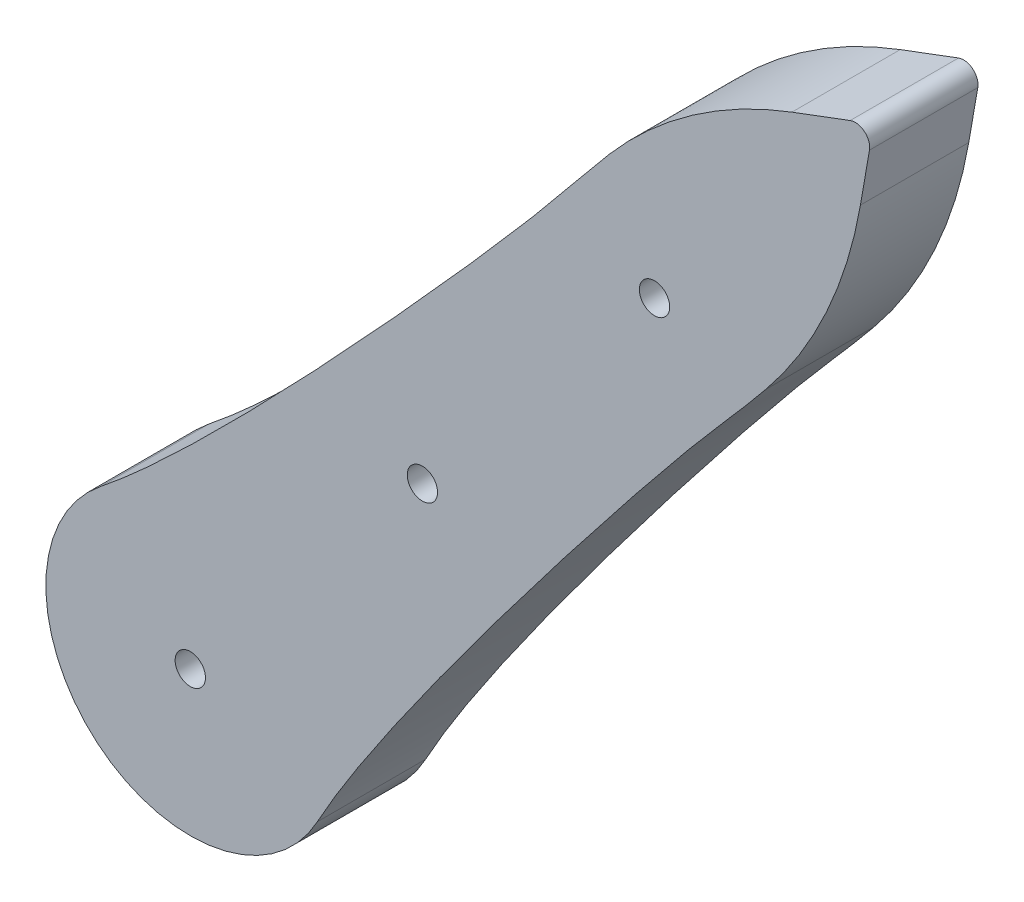
ISO-10303-21;
HEADER;
FILE_DESCRIPTION(('STEP AP214'),'2;1');
FILE_NAME('part.step','',(''),(''),'','','');
FILE_SCHEMA(('AUTOMOTIVE_DESIGN { 1 0 10303 214 1 1 1 1 }'));
ENDSEC;
DATA;
#1=APPLICATION_CONTEXT('core data for automotive mechanical design processes');
#2=APPLICATION_PROTOCOL_DEFINITION('international standard','automotive_design',2000,#1);
#3=PRODUCT_CONTEXT('',#1,'mechanical');
#4=PRODUCT('Part','Part','',(#3));
#5=PRODUCT_RELATED_PRODUCT_CATEGORY('part','',(#4));
#6=PRODUCT_DEFINITION_FORMATION('','',#4);
#7=PRODUCT_DEFINITION_CONTEXT('part definition',#1,'design');
#8=PRODUCT_DEFINITION('design','',#6,#7);
#9=PRODUCT_DEFINITION_SHAPE('','',#8);
#10=(LENGTH_UNIT() NAMED_UNIT(*) SI_UNIT(.MILLI.,.METRE.));
#11=(NAMED_UNIT(*) PLANE_ANGLE_UNIT() SI_UNIT($,.RADIAN.));
#12=(NAMED_UNIT(*) SI_UNIT($,.STERADIAN.) SOLID_ANGLE_UNIT());
#13=UNCERTAINTY_MEASURE_WITH_UNIT(LENGTH_MEASURE(1.E-05),#10,'distance_accuracy_value','');
#14=(GEOMETRIC_REPRESENTATION_CONTEXT(3) GLOBAL_UNCERTAINTY_ASSIGNED_CONTEXT((#13)) GLOBAL_UNIT_ASSIGNED_CONTEXT((#10,
#11,#12)) REPRESENTATION_CONTEXT('',''));
#15=CARTESIAN_POINT('',(0.,0.,0.));
#16=DIRECTION('',(0.,0.,1.));
#17=DIRECTION('',(1.,0.,0.));
#18=AXIS2_PLACEMENT_3D('',#15,#16,#17);
#19=CARTESIAN_POINT('',(76.5989589468399,-175.143739229266,31.));
#20=DIRECTION('',(0.,0.,1.));
#21=DIRECTION('',(1.,0.,0.));
#22=AXIS2_PLACEMENT_3D('',#19,#20,#21);
#23=PLANE('',#22);
#24=CARTESIAN_POINT('',(77.439461008357,-195.520152103908,31.));
#25=DIRECTION('',(0.,0.,1.));
#26=DIRECTION('',(1.,0.,0.));
#27=AXIS2_PLACEMENT_3D('',#24,#25,#26);
#28=CIRCLE('',#27,2.1);
#29=CARTESIAN_POINT('',(79.539461008357,-195.520152103908,31.));
#30=VERTEX_POINT('',#29);
#31=EDGE_CURVE('E166',#30,#30,#28,.T.);
#32=ORIENTED_EDGE('',*,*,#31,.F.);
#33=EDGE_LOOP('',(#32));
#34=FACE_BOUND('',#33,.T.);
#35=CARTESIAN_POINT('',(45.3000805240301,-233.822374259857,31.));
#36=DIRECTION('',(0.,0.,1.));
#37=DIRECTION('',(1.,0.,0.));
#38=AXIS2_PLACEMENT_3D('',#35,#36,#37);
#39=CIRCLE('',#38,2.09999999999999);
#40=CARTESIAN_POINT('',(47.4000805240301,-233.822374259857,31.));
#41=VERTEX_POINT('',#40);
#42=EDGE_CURVE('E248',#41,#41,#39,.T.);
#43=ORIENTED_EDGE('',*,*,#42,.F.);
#44=EDGE_LOOP('',(#43));
#45=FACE_BOUND('',#44,.T.);
#46=CARTESIAN_POINT('',(13.1607000397032,-272.124596415806,31.));
#47=DIRECTION('',(0.,0.,1.));
#48=DIRECTION('',(1.,0.,0.));
#49=AXIS2_PLACEMENT_3D('',#46,#47,#48);
#50=CIRCLE('',#49,2.09999999999999);
#51=CARTESIAN_POINT('',(15.2607000397032,-272.124596415806,31.));
#52=VERTEX_POINT('',#51);
#53=EDGE_CURVE('E242',#52,#52,#50,.T.);
#54=ORIENTED_EDGE('',*,*,#53,.F.);
#55=EDGE_LOOP('',(#54));
#56=FACE_BOUND('',#55,.T.);
#57=DIRECTION('',(0.171188077723819,0.985238368134952,0.));
#58=VECTOR('',#57,1.);
#59=CARTESIAN_POINT('',(131.533418649918,-22.8543201557875,31.));
#60=LINE('',#59,#58);
#61=CARTESIAN_POINT('',(105.949627646134,-170.096656388687,31.));
#62=VERTEX_POINT('',#61);
#63=CARTESIAN_POINT('',(107.203020482597,-162.88300734695,31.));
#64=VERTEX_POINT('',#63);
#65=EDGE_CURVE('E155',#62,#64,#60,.T.);
#66=ORIENTED_EDGE('',*,*,#65,.T.);
#67=CARTESIAN_POINT('',(105.232543746327,-162.540631191502,31.));
#68=DIRECTION('',(0.,0.,1.));
#69=DIRECTION('',(1.,0.,0.));
#70=AXIS2_PLACEMENT_3D('',#67,#68,#69);
#71=CIRCLE('',#70,2.);
#72=CARTESIAN_POINT('',(104.530123160545,-160.66803798403,31.));
#73=VERTEX_POINT('',#72);
#74=EDGE_CURVE('E61',#64,#73,#71,.T.);
#75=ORIENTED_EDGE('',*,*,#74,.T.);
#76=DIRECTION('',(0.936296603735838,0.351210292891218,0.));
#77=VECTOR('',#76,1.);
#78=CARTESIAN_POINT('',(65.7272479677985,-175.223221786994,31.));
#79=LINE('',#78,#77);
#80=CARTESIAN_POINT('',(96.4662063952185,-163.692859987763,31.));
#81=VERTEX_POINT('',#80);
#82=EDGE_CURVE('E161',#81,#73,#79,.T.);
#83=ORIENTED_EDGE('',*,*,#82,.F.);
#84=CARTESIAN_POINT('',(118.241244554474,-221.743249419385,31.));
#85=DIRECTION('',(0.,0.,1.));
#86=DIRECTION('',(1.,0.,0.));
#87=AXIS2_PLACEMENT_3D('',#84,#85,#86);
#88=CIRCLE('',#87,62.);
#89=CARTESIAN_POINT('',(71.1607255574868,-181.401896802321,31.));
#90=VERTEX_POINT('',#89);
#91=EDGE_CURVE('E107',#81,#90,#88,.T.);
#92=ORIENTED_EDGE('',*,*,#91,.T.);
#93=CARTESIAN_POINT('',(115.704809965513,-109.996492831036,31.));
#94=CARTESIAN_POINT('',(101.948797579582,-150.116707378643,31.));
#95=CARTESIAN_POINT('',(78.1787907914669,-171.772825460758,31.));
#96=CARTESIAN_POINT('',(58.7170794777346,-197.082387324868,31.));
#97=CARTESIAN_POINT('',(16.3569995422659,-244.049515563768,31.));
#98=CARTESIAN_POINT('',(0.724486189959749,-256.461244760319,31.));
#99=B_SPLINE_CURVE_WITH_KNOTS('',3,(#93,#94,#95,#96,#97,#98),.UNSPECIFIED.,.F.,.F.,(4,1,1,4),
(0.,0.619090324128096,0.719090324128096,1.),.UNSPECIFIED.);
#100=CARTESIAN_POINT('',(0.724486189959779,-256.461244760319,31.));
#101=VERTEX_POINT('',#100);
#102=EDGE_CURVE('E102',#90,#101,#99,.T.);
#103=ORIENTED_EDGE('',*,*,#102,.T.);
#104=CARTESIAN_POINT('',(13.1607000397032,-272.124596415806,31.));
#105=DIRECTION('',(0.,0.,1.));
#106=DIRECTION('',(1.,0.,0.));
#107=AXIS2_PLACEMENT_3D('',#104,#105,#106);
#108=CIRCLE('',#107,20.);
#109=CARTESIAN_POINT('',(30.7456160602677,-281.651963762019,31.));
#110=VERTEX_POINT('',#109);
#111=EDGE_CURVE('E105',#101,#110,#108,.T.);
#112=ORIENTED_EDGE('',*,*,#111,.T.);
#113=CARTESIAN_POINT('',(30.7456160602677,-281.651963762019,31.));
#114=CARTESIAN_POINT('',(40.2542257453367,-264.101669256925,31.));
#115=CARTESIAN_POINT('',(79.1520670851047,-214.229377889324,31.));
#116=CARTESIAN_POINT('',(100.697629130312,-190.668374405424,31.));
#117=CARTESIAN_POINT('',(117.89712375584,-163.498941991036,31.));
#118=CARTESIAN_POINT('',(155.019115612056,-142.985112199041,31.));
#119=B_SPLINE_CURVE_WITH_KNOTS('',3,(#113,#114,#115,#116,#117,#118),.UNSPECIFIED.,.F.,.F.,(4,1,
1,4),(0.,0.280909675871904,0.380909675871904,1.),.UNSPECIFIED.);
#120=CARTESIAN_POINT('',(92.843413509012,-198.752033380175,31.));
#121=VERTEX_POINT('',#120);
#122=EDGE_CURVE('E120',#110,#121,#119,.T.);
#123=ORIENTED_EDGE('',*,*,#122,.T.);
#124=CARTESIAN_POINT('',(44.8648488217668,-159.482995569811,31.));
#125=DIRECTION('',(0.,0.,1.));
#126=DIRECTION('',(1.,0.,0.));
#127=AXIS2_PLACEMENT_3D('',#124,#125,#126);
#128=CIRCLE('',#127,62.);
#129=EDGE_CURVE('E129',#121,#62,#128,.T.);
#130=ORIENTED_EDGE('',*,*,#129,.T.);
#131=EDGE_LOOP('',(#66,#75,#83,#92,#103,#112,#123,#130));
#132=FACE_BOUND('',#131,.T.);
#133=ADVANCED_FACE('F39',(#34,#45,#56,#132),#23,.T.);
#134=CARTESIAN_POINT('',(76.5989589468399,-175.143739229266,16.));
#135=DIRECTION('',(0.,0.,1.));
#136=DIRECTION('',(1.,0.,0.));
#137=AXIS2_PLACEMENT_3D('',#134,#135,#136);
#138=PLANE('',#137);
#139=CARTESIAN_POINT('',(77.439461008357,-195.520152103908,16.));
#140=DIRECTION('',(0.,0.,1.));
#141=DIRECTION('',(1.,0.,0.));
#142=AXIS2_PLACEMENT_3D('',#139,#140,#141);
#143=CIRCLE('',#142,2.1);
#144=CARTESIAN_POINT('',(79.539461008357,-195.520152103908,16.));
#145=VERTEX_POINT('',#144);
#146=EDGE_CURVE('E162',#145,#145,#143,.T.);
#147=ORIENTED_EDGE('',*,*,#146,.T.);
#148=EDGE_LOOP('',(#147));
#149=FACE_BOUND('',#148,.T.);
#150=CARTESIAN_POINT('',(45.3000805240301,-233.822374259857,16.));
#151=DIRECTION('',(0.,0.,1.));
#152=DIRECTION('',(1.,0.,0.));
#153=AXIS2_PLACEMENT_3D('',#150,#151,#152);
#154=CIRCLE('',#153,2.09999999999999);
#155=CARTESIAN_POINT('',(47.4000805240301,-233.822374259857,16.));
#156=VERTEX_POINT('',#155);
#157=EDGE_CURVE('E245',#156,#156,#154,.T.);
#158=ORIENTED_EDGE('',*,*,#157,.T.);
#159=EDGE_LOOP('',(#158));
#160=FACE_BOUND('',#159,.T.);
#161=CARTESIAN_POINT('',(13.1607000397032,-272.124596415806,16.));
#162=DIRECTION('',(0.,0.,1.));
#163=DIRECTION('',(1.,0.,0.));
#164=AXIS2_PLACEMENT_3D('',#161,#162,#163);
#165=CIRCLE('',#164,2.09999999999999);
#166=CARTESIAN_POINT('',(15.2607000397032,-272.124596415806,16.));
#167=VERTEX_POINT('',#166);
#168=EDGE_CURVE('E239',#167,#167,#165,.T.);
#169=ORIENTED_EDGE('',*,*,#168,.T.);
#170=EDGE_LOOP('',(#169));
#171=FACE_BOUND('',#170,.T.);
#172=DIRECTION('',(0.936296603735838,0.351210292891218,0.));
#173=VECTOR('',#172,1.);
#174=CARTESIAN_POINT('',(65.7272479677985,-175.223221786994,16.));
#175=LINE('',#174,#173);
#176=CARTESIAN_POINT('',(96.4662063952185,-163.692859987763,16.));
#177=VERTEX_POINT('',#176);
#178=CARTESIAN_POINT('',(104.530123160545,-160.66803798403,16.));
#179=VERTEX_POINT('',#178);
#180=EDGE_CURVE('E169',#177,#179,#175,.T.);
#181=ORIENTED_EDGE('',*,*,#180,.T.);
#182=CARTESIAN_POINT('',(105.232543746327,-162.540631191502,16.));
#183=DIRECTION('',(0.,0.,1.));
#184=DIRECTION('',(1.,0.,0.));
#185=AXIS2_PLACEMENT_3D('',#182,#183,#184);
#186=CIRCLE('',#185,2.);
#187=CARTESIAN_POINT('',(107.203020482597,-162.88300734695,16.));
#188=VERTEX_POINT('',#187);
#189=EDGE_CURVE('E11',#179,#188,#186,.F.);
#190=ORIENTED_EDGE('',*,*,#189,.T.);
#191=DIRECTION('',(0.171188077723819,0.985238368134952,0.));
#192=VECTOR('',#191,1.);
#193=CARTESIAN_POINT('',(131.533418649918,-22.8543201557875,16.));
#194=LINE('',#193,#192);
#195=CARTESIAN_POINT('',(105.949627646134,-170.096656388687,16.));
#196=VERTEX_POINT('',#195);
#197=EDGE_CURVE('E158',#196,#188,#194,.T.);
#198=ORIENTED_EDGE('',*,*,#197,.F.);
#199=CARTESIAN_POINT('',(44.8648488217668,-159.482995569811,16.));
#200=DIRECTION('',(0.,0.,1.));
#201=DIRECTION('',(1.,0.,0.));
#202=AXIS2_PLACEMENT_3D('',#199,#200,#201);
#203=CIRCLE('',#202,62.);
#204=CARTESIAN_POINT('',(92.843413509012,-198.752033380175,16.));
#205=VERTEX_POINT('',#204);
#206=EDGE_CURVE('E138',#196,#205,#203,.F.);
#207=ORIENTED_EDGE('',*,*,#206,.T.);
#208=CARTESIAN_POINT('',(30.7456160602677,-281.651963762019,16.));
#209=CARTESIAN_POINT('',(40.2542257453367,-264.101669256925,16.));
#210=CARTESIAN_POINT('',(79.1520670851047,-214.229377889324,16.));
#211=CARTESIAN_POINT('',(100.697629130312,-190.668374405424,16.));
#212=CARTESIAN_POINT('',(117.89712375584,-163.498941991036,16.));
#213=CARTESIAN_POINT('',(155.019115612056,-142.985112199041,16.));
#214=B_SPLINE_CURVE_WITH_KNOTS('',3,(#208,#209,#210,#211,#212,#213),.UNSPECIFIED.,.F.,.F.,(4,1,
1,4),(0.,0.280909675871904,0.380909675871904,1.),.UNSPECIFIED.);
#215=CARTESIAN_POINT('',(30.7456160602677,-281.651963762019,16.));
#216=VERTEX_POINT('',#215);
#217=EDGE_CURVE('E111',#216,#205,#214,.T.);
#218=ORIENTED_EDGE('',*,*,#217,.F.);
#219=CARTESIAN_POINT('',(13.1607000397032,-272.124596415806,16.));
#220=DIRECTION('',(0.,0.,1.));
#221=DIRECTION('',(1.,0.,0.));
#222=AXIS2_PLACEMENT_3D('',#219,#220,#221);
#223=CIRCLE('',#222,20.);
#224=CARTESIAN_POINT('',(0.724486189959779,-256.461244760319,16.));
#225=VERTEX_POINT('',#224);
#226=EDGE_CURVE('E225',#225,#216,#223,.T.);
#227=ORIENTED_EDGE('',*,*,#226,.F.);
#228=CARTESIAN_POINT('',(115.704809965513,-109.996492831036,16.));
#229=CARTESIAN_POINT('',(101.948797579582,-150.116707378643,16.));
#230=CARTESIAN_POINT('',(78.1787907914669,-171.772825460758,16.));
#231=CARTESIAN_POINT('',(58.7170794777346,-197.082387324868,16.));
#232=CARTESIAN_POINT('',(16.3569995422659,-244.049515563768,16.));
#233=CARTESIAN_POINT('',(0.724486189959749,-256.461244760319,16.));
#234=B_SPLINE_CURVE_WITH_KNOTS('',3,(#228,#229,#230,#231,#232,#233),.UNSPECIFIED.,.F.,.F.,(4,1,
1,4),(0.,0.619090324128096,0.719090324128096,1.),.UNSPECIFIED.);
#235=CARTESIAN_POINT('',(71.1607255574868,-181.401896802321,16.));
#236=VERTEX_POINT('',#235);
#237=EDGE_CURVE('E124',#236,#225,#234,.T.);
#238=ORIENTED_EDGE('',*,*,#237,.F.);
#239=CARTESIAN_POINT('',(118.241244554474,-221.743249419385,16.));
#240=DIRECTION('',(0.,0.,1.));
#241=DIRECTION('',(1.,0.,0.));
#242=AXIS2_PLACEMENT_3D('',#239,#240,#241);
#243=CIRCLE('',#242,62.);
#244=EDGE_CURVE('E140',#236,#177,#243,.F.);
#245=ORIENTED_EDGE('',*,*,#244,.T.);
#246=EDGE_LOOP('',(#181,#190,#198,#207,#218,#227,#238,#245));
#247=FACE_BOUND('',#246,.T.);
#248=ADVANCED_FACE('F200',(#149,#160,#171,#247),#138,.F.);
#249=DIRECTION('',(0.,0.,-1.));
#250=VECTOR('',#249,1.);
#251=SURFACE_OF_LINEAR_EXTRUSION('',#119,#250);
#252=ORIENTED_EDGE('',*,*,#217,.T.);
#253=DIRECTION('',(0.,0.,-1.));
#254=VECTOR('',#253,1.);
#255=CARTESIAN_POINT('',(92.843413509012,-198.752033380175,16.));
#256=LINE('',#255,#254);
#257=EDGE_CURVE('E142',#205,#121,#256,.F.);
#258=ORIENTED_EDGE('',*,*,#257,.T.);
#259=ORIENTED_EDGE('',*,*,#122,.F.);
#260=DIRECTION('',(0.,0.,-1.));
#261=VECTOR('',#260,1.);
#262=CARTESIAN_POINT('',(30.7456160602677,-281.651963762019,31.));
#263=LINE('',#262,#261);
#264=EDGE_CURVE('E118',#110,#216,#263,.T.);
#265=ORIENTED_EDGE('',*,*,#264,.T.);
#266=EDGE_LOOP('',(#252,#258,#259,#265));
#267=FACE_BOUND('',#266,.T.);
#268=ADVANCED_FACE('F182',(#267),#251,.F.);
#269=DIRECTION('',(0.,0.,-1.));
#270=VECTOR('',#269,1.);
#271=SURFACE_OF_LINEAR_EXTRUSION('',#99,#270);
#272=ORIENTED_EDGE('',*,*,#102,.F.);
#273=DIRECTION('',(0.,0.,-1.));
#274=VECTOR('',#273,1.);
#275=CARTESIAN_POINT('',(71.1607255574868,-181.401896802321,31.));
#276=LINE('',#275,#274);
#277=EDGE_CURVE('E136',#90,#236,#276,.T.);
#278=ORIENTED_EDGE('',*,*,#277,.T.);
#279=ORIENTED_EDGE('',*,*,#237,.T.);
#280=DIRECTION('',(0.,0.,-1.));
#281=VECTOR('',#280,1.);
#282=CARTESIAN_POINT('',(0.724486189959779,-256.461244760319,31.));
#283=LINE('',#282,#281);
#284=EDGE_CURVE('E116',#101,#225,#283,.T.);
#285=ORIENTED_EDGE('',*,*,#284,.F.);
#286=EDGE_LOOP('',(#272,#278,#279,#285));
#287=FACE_BOUND('',#286,.T.);
#288=ADVANCED_FACE('F122',(#287),#271,.F.);
#289=CARTESIAN_POINT('',(13.1607000397032,-272.124596415806,31.));
#290=DIRECTION('',(0.,0.,-1.));
#291=DIRECTION('',(-1.,0.,0.));
#292=AXIS2_PLACEMENT_3D('',#289,#290,#291);
#293=CYLINDRICAL_SURFACE('',#292,20.);
#294=ORIENTED_EDGE('',*,*,#226,.T.);
#295=ORIENTED_EDGE('',*,*,#264,.F.);
#296=ORIENTED_EDGE('',*,*,#111,.F.);
#297=ORIENTED_EDGE('',*,*,#284,.T.);
#298=EDGE_LOOP('',(#294,#295,#296,#297));
#299=FACE_BOUND('',#298,.T.);
#300=ADVANCED_FACE('F115',(#299),#293,.T.);
#301=CARTESIAN_POINT('',(131.533418649918,-22.8543201557875,16.));
#302=DIRECTION('',(0.985238368134952,-0.171188077723819,0.));
#303=DIRECTION('',(0.171188077723819,0.985238368134952,0.));
#304=AXIS2_PLACEMENT_3D('',#301,#302,#303);
#305=PLANE('',#304);
#306=ORIENTED_EDGE('',*,*,#197,.T.);
#307=DIRECTION('',(0.,0.,1.));
#308=VECTOR('',#307,1.);
#309=CARTESIAN_POINT('',(107.203020482597,-162.88300734695,31.));
#310=LINE('',#309,#308);
#311=EDGE_CURVE('E147',#188,#64,#310,.T.);
#312=ORIENTED_EDGE('',*,*,#311,.T.);
#313=ORIENTED_EDGE('',*,*,#65,.F.);
#314=DIRECTION('',(0.,0.,1.));
#315=VECTOR('',#314,1.);
#316=CARTESIAN_POINT('',(105.949627646134,-170.096656388687,16.));
#317=LINE('',#316,#315);
#318=EDGE_CURVE('E145',#62,#196,#317,.F.);
#319=ORIENTED_EDGE('',*,*,#318,.T.);
#320=EDGE_LOOP('',(#306,#312,#313,#319));
#321=FACE_BOUND('',#320,.T.);
#322=ADVANCED_FACE('F154',(#321),#305,.T.);
#323=CARTESIAN_POINT('',(65.7272479677985,-175.223221786994,16.));
#324=DIRECTION('',(0.351210292891218,-0.936296603735838,0.));
#325=DIRECTION('',(0.936296603735838,0.351210292891218,0.));
#326=AXIS2_PLACEMENT_3D('',#323,#324,#325);
#327=PLANE('',#326);
#328=ORIENTED_EDGE('',*,*,#82,.T.);
#329=DIRECTION('',(0.,0.,1.));
#330=VECTOR('',#329,1.);
#331=CARTESIAN_POINT('',(104.530123160545,-160.66803798403,16.));
#332=LINE('',#331,#330);
#333=EDGE_CURVE('E47',#73,#179,#332,.F.);
#334=ORIENTED_EDGE('',*,*,#333,.T.);
#335=ORIENTED_EDGE('',*,*,#180,.F.);
#336=DIRECTION('',(0.,0.,-1.));
#337=VECTOR('',#336,1.);
#338=CARTESIAN_POINT('',(96.4662063952185,-163.692859987763,16.));
#339=LINE('',#338,#337);
#340=EDGE_CURVE('E126',#177,#81,#339,.F.);
#341=ORIENTED_EDGE('',*,*,#340,.T.);
#342=EDGE_LOOP('',(#328,#334,#335,#341));
#343=FACE_BOUND('',#342,.T.);
#344=ADVANCED_FACE('F187',(#343),#327,.F.);
#345=CARTESIAN_POINT('',(118.241244554474,-221.743249419385,23.5));
#346=DIRECTION('',(0.,0.,-1.));
#347=DIRECTION('',(-1.,0.,0.));
#348=AXIS2_PLACEMENT_3D('',#345,#346,#347);
#349=CYLINDRICAL_SURFACE('',#348,62.);
#350=ORIENTED_EDGE('',*,*,#244,.F.);
#351=ORIENTED_EDGE('',*,*,#277,.F.);
#352=ORIENTED_EDGE('',*,*,#91,.F.);
#353=ORIENTED_EDGE('',*,*,#340,.F.);
#354=EDGE_LOOP('',(#350,#351,#352,#353));
#355=FACE_BOUND('',#354,.T.);
#356=ADVANCED_FACE('F184',(#355),#349,.T.);
#357=CARTESIAN_POINT('',(44.8648488217668,-159.482995569811,23.5));
#358=DIRECTION('',(0.,0.,-1.));
#359=DIRECTION('',(-1.,0.,0.));
#360=AXIS2_PLACEMENT_3D('',#357,#358,#359);
#361=CYLINDRICAL_SURFACE('',#360,62.);
#362=ORIENTED_EDGE('',*,*,#206,.F.);
#363=ORIENTED_EDGE('',*,*,#318,.F.);
#364=ORIENTED_EDGE('',*,*,#129,.F.);
#365=ORIENTED_EDGE('',*,*,#257,.F.);
#366=EDGE_LOOP('',(#362,#363,#364,#365));
#367=FACE_BOUND('',#366,.T.);
#368=ADVANCED_FACE('F186',(#367),#361,.T.);
#369=CARTESIAN_POINT('',(13.1607000397032,-272.124596415806,16.));
#370=DIRECTION('',(0.,0.,1.));
#371=DIRECTION('',(1.,0.,0.));
#372=AXIS2_PLACEMENT_3D('',#369,#370,#371);
#373=CYLINDRICAL_SURFACE('',#372,2.09999999999999);
#374=ORIENTED_EDGE('',*,*,#168,.F.);
#375=EDGE_LOOP('',(#374));
#376=FACE_BOUND('',#375,.T.);
#377=ORIENTED_EDGE('',*,*,#53,.T.);
#378=EDGE_LOOP('',(#377));
#379=FACE_BOUND('',#378,.T.);
#380=ADVANCED_FACE('F190',(#376,#379),#373,.F.);
#381=CARTESIAN_POINT('',(45.3000805240301,-233.822374259857,16.));
#382=DIRECTION('',(0.,0.,1.));
#383=DIRECTION('',(1.,0.,0.));
#384=AXIS2_PLACEMENT_3D('',#381,#382,#383);
#385=CYLINDRICAL_SURFACE('',#384,2.09999999999999);
#386=ORIENTED_EDGE('',*,*,#157,.F.);
#387=EDGE_LOOP('',(#386));
#388=FACE_BOUND('',#387,.T.);
#389=ORIENTED_EDGE('',*,*,#42,.T.);
#390=EDGE_LOOP('',(#389));
#391=FACE_BOUND('',#390,.T.);
#392=ADVANCED_FACE('F195',(#388,#391),#385,.F.);
#393=CARTESIAN_POINT('',(77.439461008357,-195.520152103908,16.));
#394=DIRECTION('',(0.,0.,1.));
#395=DIRECTION('',(1.,0.,0.));
#396=AXIS2_PLACEMENT_3D('',#393,#394,#395);
#397=CYLINDRICAL_SURFACE('',#396,2.1);
#398=ORIENTED_EDGE('',*,*,#146,.F.);
#399=EDGE_LOOP('',(#398));
#400=FACE_BOUND('',#399,.T.);
#401=ORIENTED_EDGE('',*,*,#31,.T.);
#402=EDGE_LOOP('',(#401));
#403=FACE_BOUND('',#402,.T.);
#404=ADVANCED_FACE('F253',(#400,#403),#397,.F.);
#405=CARTESIAN_POINT('',(105.232543746327,-162.540631191502,16.));
#406=DIRECTION('',(0.,0.,-1.));
#407=DIRECTION('',(-1.,0.,0.));
#408=AXIS2_PLACEMENT_3D('',#405,#406,#407);
#409=CYLINDRICAL_SURFACE('',#408,2.);
#410=ORIENTED_EDGE('',*,*,#189,.F.);
#411=ORIENTED_EDGE('',*,*,#333,.F.);
#412=ORIENTED_EDGE('',*,*,#74,.F.);
#413=ORIENTED_EDGE('',*,*,#311,.F.);
#414=EDGE_LOOP('',(#410,#411,#412,#413));
#415=FACE_BOUND('',#414,.T.);
#416=ADVANCED_FACE('F41',(#415),#409,.T.);
#417=CLOSED_SHELL('',(#133,#248,#268,#288,#300,#322,#344,#356,#368,#380,#392,#404,#416));
#418=MANIFOLD_SOLID_BREP('B2',#417);
#419=ADVANCED_BREP_SHAPE_REPRESENTATION('',(#18,#418),#14);
#420=SHAPE_DEFINITION_REPRESENTATION(#9,#419);
ENDSEC;
END-ISO-10303-21;
